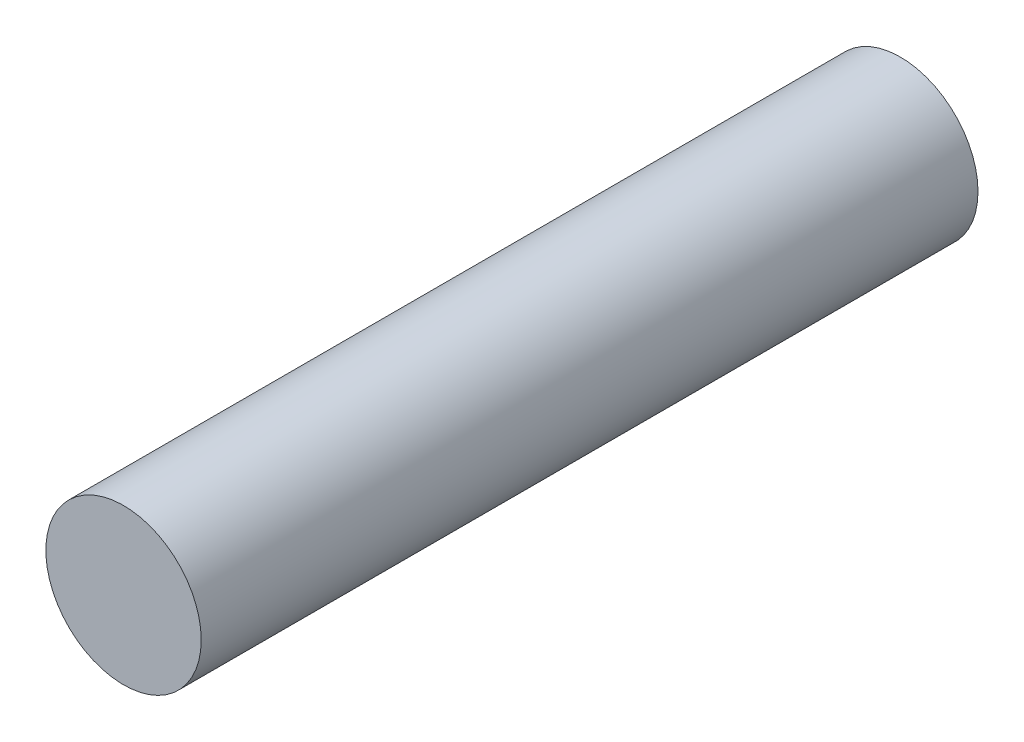
ISO-10303-21;
HEADER;
FILE_DESCRIPTION(('STEP AP214'),'2;1');
FILE_NAME('part.step','',(''),(''),'','','');
FILE_SCHEMA(('AUTOMOTIVE_DESIGN { 1 0 10303 214 1 1 1 1 }'));
ENDSEC;
DATA;
#1=APPLICATION_CONTEXT('core data for automotive mechanical design processes');
#2=APPLICATION_PROTOCOL_DEFINITION('international standard','automotive_design',2000,#1);
#3=PRODUCT_CONTEXT('',#1,'mechanical');
#4=PRODUCT('Part','Part','',(#3));
#5=PRODUCT_RELATED_PRODUCT_CATEGORY('part','',(#4));
#6=PRODUCT_DEFINITION_FORMATION('','',#4);
#7=PRODUCT_DEFINITION_CONTEXT('part definition',#1,'design');
#8=PRODUCT_DEFINITION('design','',#6,#7);
#9=PRODUCT_DEFINITION_SHAPE('','',#8);
#10=(LENGTH_UNIT() NAMED_UNIT(*) SI_UNIT(.MILLI.,.METRE.));
#11=(NAMED_UNIT(*) PLANE_ANGLE_UNIT() SI_UNIT($,.RADIAN.));
#12=(NAMED_UNIT(*) SI_UNIT($,.STERADIAN.) SOLID_ANGLE_UNIT());
#13=UNCERTAINTY_MEASURE_WITH_UNIT(LENGTH_MEASURE(1.E-05),#10,'distance_accuracy_value','');
#14=(GEOMETRIC_REPRESENTATION_CONTEXT(3) GLOBAL_UNCERTAINTY_ASSIGNED_CONTEXT((#13)) GLOBAL_UNIT_ASSIGNED_CONTEXT((#10,
#11,#12)) REPRESENTATION_CONTEXT('',''));
#15=CARTESIAN_POINT('',(0.,0.,0.));
#16=DIRECTION('',(0.,0.,1.));
#17=DIRECTION('',(1.,0.,0.));
#18=AXIS2_PLACEMENT_3D('',#15,#16,#17);
#19=CARTESIAN_POINT('',(0.,0.,1000.));
#20=DIRECTION('',(0.,0.,-1.));
#21=DIRECTION('',(-1.,0.,0.));
#22=AXIS2_PLACEMENT_3D('',#19,#20,#21);
#23=CYLINDRICAL_SURFACE('',#22,100.);
#24=CARTESIAN_POINT('',(0.,0.,1000.));
#25=DIRECTION('',(0.,0.,1.));
#26=DIRECTION('',(1.,0.,0.));
#27=AXIS2_PLACEMENT_3D('',#24,#25,#26);
#28=CIRCLE('',#27,100.);
#29=CARTESIAN_POINT('',(100.,0.,1000.));
#30=VERTEX_POINT('',#29);
#31=EDGE_CURVE('E10',#30,#30,#28,.T.);
#32=ORIENTED_EDGE('',*,*,#31,.F.);
#33=EDGE_LOOP('',(#32));
#34=FACE_BOUND('',#33,.T.);
#35=CARTESIAN_POINT('',(0.,0.,0.));
#36=DIRECTION('',(0.,0.,1.));
#37=DIRECTION('',(1.,0.,0.));
#38=AXIS2_PLACEMENT_3D('',#35,#36,#37);
#39=CIRCLE('',#38,100.);
#40=CARTESIAN_POINT('',(100.,0.,0.));
#41=VERTEX_POINT('',#40);
#42=EDGE_CURVE('E38',#41,#41,#39,.T.);
#43=ORIENTED_EDGE('',*,*,#42,.T.);
#44=EDGE_LOOP('',(#43));
#45=FACE_BOUND('',#44,.T.);
#46=ADVANCED_FACE('F35',(#34,#45),#23,.T.);
#47=CARTESIAN_POINT('',(0.,0.,1000.));
#48=DIRECTION('',(0.,0.,1.));
#49=DIRECTION('',(1.,0.,0.));
#50=AXIS2_PLACEMENT_3D('',#47,#48,#49);
#51=PLANE('',#50);
#52=ORIENTED_EDGE('',*,*,#31,.T.);
#53=EDGE_LOOP('',(#52));
#54=FACE_BOUND('',#53,.T.);
#55=ADVANCED_FACE('F50',(#54),#51,.T.);
#56=CARTESIAN_POINT('',(0.,0.,0.));
#57=DIRECTION('',(0.,0.,1.));
#58=DIRECTION('',(1.,0.,0.));
#59=AXIS2_PLACEMENT_3D('',#56,#57,#58);
#60=PLANE('',#59);
#61=ORIENTED_EDGE('',*,*,#42,.F.);
#62=EDGE_LOOP('',(#61));
#63=FACE_BOUND('',#62,.T.);
#64=ADVANCED_FACE('F48',(#63),#60,.F.);
#65=CLOSED_SHELL('',(#46,#55,#64));
#66=MANIFOLD_SOLID_BREP('B2',#65);
#67=ADVANCED_BREP_SHAPE_REPRESENTATION('',(#18,#66),#14);
#68=SHAPE_DEFINITION_REPRESENTATION(#9,#67);
ENDSEC;
END-ISO-10303-21;
